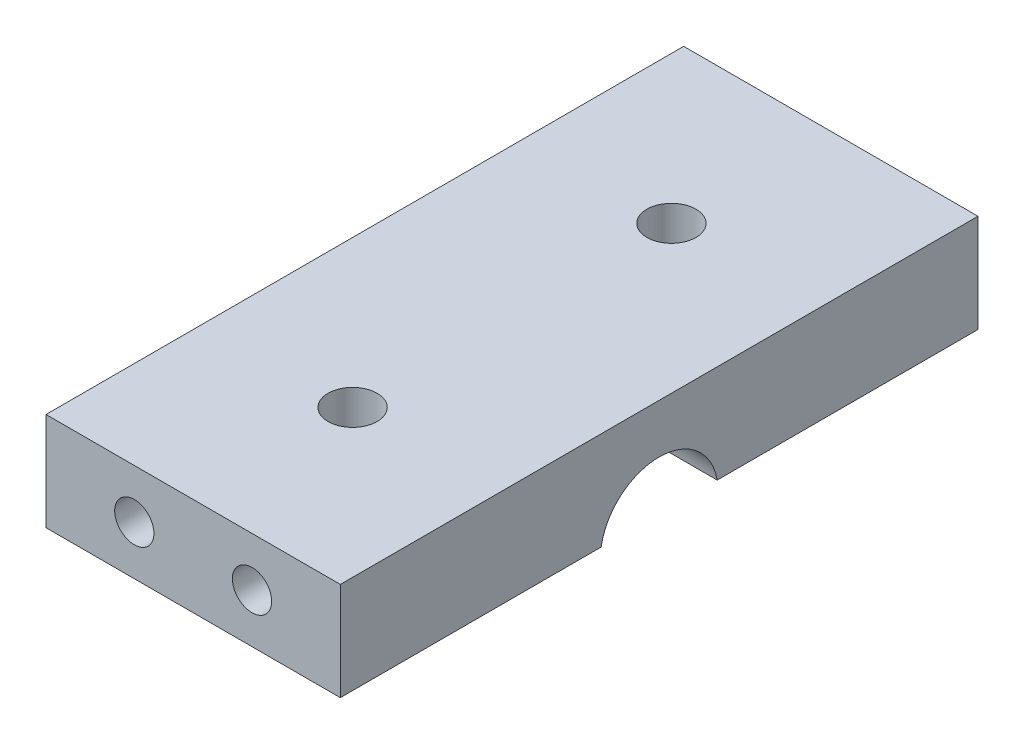
ISO-10303-21;
HEADER;
FILE_DESCRIPTION(('STEP AP214'),'2;1');
FILE_NAME('part.step','',(''),(''),'','','');
FILE_SCHEMA(('AUTOMOTIVE_DESIGN { 1 0 10303 214 1 1 1 1 }'));
ENDSEC;
DATA;
#1=APPLICATION_CONTEXT('core data for automotive mechanical design processes');
#2=APPLICATION_PROTOCOL_DEFINITION('international standard','automotive_design',2000,#1);
#3=PRODUCT_CONTEXT('',#1,'mechanical');
#4=PRODUCT('Part','Part','',(#3));
#5=PRODUCT_RELATED_PRODUCT_CATEGORY('part','',(#4));
#6=PRODUCT_DEFINITION_FORMATION('','',#4);
#7=PRODUCT_DEFINITION_CONTEXT('part definition',#1,'design');
#8=PRODUCT_DEFINITION('design','',#6,#7);
#9=PRODUCT_DEFINITION_SHAPE('','',#8);
#10=(LENGTH_UNIT() NAMED_UNIT(*) SI_UNIT(.MILLI.,.METRE.));
#11=(NAMED_UNIT(*) PLANE_ANGLE_UNIT() SI_UNIT($,.RADIAN.));
#12=(NAMED_UNIT(*) SI_UNIT($,.STERADIAN.) SOLID_ANGLE_UNIT());
#13=UNCERTAINTY_MEASURE_WITH_UNIT(LENGTH_MEASURE(1.E-05),#10,'distance_accuracy_value','');
#14=(GEOMETRIC_REPRESENTATION_CONTEXT(3) GLOBAL_UNCERTAINTY_ASSIGNED_CONTEXT((#13)) GLOBAL_UNIT_ASSIGNED_CONTEXT((#10,
#11,#12)) REPRESENTATION_CONTEXT('',''));
#15=CARTESIAN_POINT('',(0.,0.,0.));
#16=DIRECTION('',(0.,0.,1.));
#17=DIRECTION('',(1.,0.,0.));
#18=AXIS2_PLACEMENT_3D('',#15,#16,#17);
#19=CARTESIAN_POINT('',(0.,0.,-65.));
#20=DIRECTION('',(0.,-1.,0.));
#21=DIRECTION('',(0.,0.,-1.));
#22=AXIS2_PLACEMENT_3D('',#19,#20,#21);
#23=PLANE('',#22);
#24=CARTESIAN_POINT('',(15.,0.,-48.7500000000384));
#25=DIRECTION('',(0.,1.,0.));
#26=DIRECTION('',(0.,0.,1.));
#27=AXIS2_PLACEMENT_3D('',#24,#25,#26);
#28=CIRCLE('',#27,2.49999999999892);
#29=CARTESIAN_POINT('',(15.,0.,-46.2500000000395));
#30=VERTEX_POINT('',#29);
#31=EDGE_CURVE('E106',#30,#30,#28,.T.);
#32=ORIENTED_EDGE('',*,*,#31,.T.);
#33=EDGE_LOOP('',(#32));
#34=FACE_BOUND('',#33,.T.);
#35=DIRECTION('',(1.,0.,0.));
#36=VECTOR('',#35,1.);
#37=CARTESIAN_POINT('',(0.,0.,-38.4160797830984));
#38=LINE('',#37,#36);
#39=CARTESIAN_POINT('',(0.,0.,-38.4160797830984));
#40=VERTEX_POINT('',#39);
#41=CARTESIAN_POINT('',(30.,0.,-38.4160797830984));
#42=VERTEX_POINT('',#41);
#43=EDGE_CURVE('E11',#40,#42,#38,.T.);
#44=ORIENTED_EDGE('',*,*,#43,.F.);
#45=DIRECTION('',(0.,0.,1.));
#46=VECTOR('',#45,1.);
#47=CARTESIAN_POINT('',(0.,0.,0.));
#48=LINE('',#47,#46);
#49=CARTESIAN_POINT('',(0.,0.,-65.));
#50=VERTEX_POINT('',#49);
#51=EDGE_CURVE('E110',#50,#40,#48,.T.);
#52=ORIENTED_EDGE('',*,*,#51,.F.);
#53=DIRECTION('',(-1.,0.,0.));
#54=VECTOR('',#53,1.);
#55=CARTESIAN_POINT('',(0.,0.,-65.));
#56=LINE('',#55,#54);
#57=CARTESIAN_POINT('',(30.,0.,-65.));
#58=VERTEX_POINT('',#57);
#59=EDGE_CURVE('E75',#58,#50,#56,.T.);
#60=ORIENTED_EDGE('',*,*,#59,.F.);
#61=DIRECTION('',(0.,0.,-1.));
#62=VECTOR('',#61,1.);
#63=CARTESIAN_POINT('',(30.,0.,0.));
#64=LINE('',#63,#62);
#65=EDGE_CURVE('E102',#42,#58,#64,.T.);
#66=ORIENTED_EDGE('',*,*,#65,.F.);
#67=EDGE_LOOP('',(#44,#52,#60,#66));
#68=FACE_BOUND('',#67,.T.);
#69=ADVANCED_FACE('F31',(#34,#68),#23,.T.);
#70=CARTESIAN_POINT('',(0.,10.,0.));
#71=DIRECTION('',(1.,0.,0.));
#72=DIRECTION('',(0.,0.,-1.));
#73=AXIS2_PLACEMENT_3D('',#70,#71,#72);
#74=PLANE('',#73);
#75=ORIENTED_EDGE('',*,*,#51,.T.);
#76=CARTESIAN_POINT('',(0.,-1.,-32.5));
#77=DIRECTION('',(1.,0.,0.));
#78=DIRECTION('',(0.,0.,-1.));
#79=AXIS2_PLACEMENT_3D('',#76,#77,#78);
#80=CIRCLE('',#79,5.99999999999876);
#81=CARTESIAN_POINT('',(0.,0.,-26.5839202169016));
#82=VERTEX_POINT('',#81);
#83=EDGE_CURVE('E93',#40,#82,#80,.T.);
#84=ORIENTED_EDGE('',*,*,#83,.T.);
#85=CARTESIAN_POINT('',(0.,0.,0.));
#86=VERTEX_POINT('',#85);
#87=EDGE_CURVE('E127',#82,#86,#48,.T.);
#88=ORIENTED_EDGE('',*,*,#87,.T.);
#89=DIRECTION('',(0.,-1.,0.));
#90=VECTOR('',#89,1.);
#91=CARTESIAN_POINT('',(0.,10.,0.));
#92=LINE('',#91,#90);
#93=CARTESIAN_POINT('',(0.,10.,0.));
#94=VERTEX_POINT('',#93);
#95=EDGE_CURVE('E122',#94,#86,#92,.T.);
#96=ORIENTED_EDGE('',*,*,#95,.F.);
#97=DIRECTION('',(0.,0.,1.));
#98=VECTOR('',#97,1.);
#99=CARTESIAN_POINT('',(0.,10.,0.));
#100=LINE('',#99,#98);
#101=CARTESIAN_POINT('',(0.,10.,-65.));
#102=VERTEX_POINT('',#101);
#103=EDGE_CURVE('E115',#102,#94,#100,.T.);
#104=ORIENTED_EDGE('',*,*,#103,.F.);
#105=DIRECTION('',(0.,-1.,0.));
#106=VECTOR('',#105,1.);
#107=CARTESIAN_POINT('',(0.,10.,-65.));
#108=LINE('',#107,#106);
#109=EDGE_CURVE('E116',#102,#50,#108,.T.);
#110=ORIENTED_EDGE('',*,*,#109,.T.);
#111=EDGE_LOOP('',(#75,#84,#88,#96,#104,#110));
#112=FACE_BOUND('',#111,.T.);
#113=ADVANCED_FACE('F33',(#112),#74,.F.);
#114=CARTESIAN_POINT('',(0.,10.,0.));
#115=DIRECTION('',(0.,0.,-1.));
#116=DIRECTION('',(-1.,0.,0.));
#117=AXIS2_PLACEMENT_3D('',#114,#115,#116);
#118=PLANE('',#117);
#119=CARTESIAN_POINT('',(21.,5.00000075745958,0.));
#120=DIRECTION('',(0.,0.,1.));
#121=DIRECTION('',(1.,0.,0.));
#122=AXIS2_PLACEMENT_3D('',#119,#120,#121);
#123=CIRCLE('',#122,1.999999999873);
#124=CARTESIAN_POINT('',(22.999999999873,5.00000075745958,0.));
#125=VERTEX_POINT('',#124);
#126=EDGE_CURVE('E155',#125,#125,#123,.T.);
#127=ORIENTED_EDGE('',*,*,#126,.F.);
#128=EDGE_LOOP('',(#127));
#129=FACE_BOUND('',#128,.T.);
#130=CARTESIAN_POINT('',(8.99999999999997,5.00000075745958,0.));
#131=DIRECTION('',(0.,0.,1.));
#132=DIRECTION('',(1.,0.,0.));
#133=AXIS2_PLACEMENT_3D('',#130,#131,#132);
#134=CIRCLE('',#133,1.99999999987299);
#135=CARTESIAN_POINT('',(10.999999999873,5.00000075745958,0.));
#136=VERTEX_POINT('',#135);
#137=EDGE_CURVE('E149',#136,#136,#134,.T.);
#138=ORIENTED_EDGE('',*,*,#137,.F.);
#139=EDGE_LOOP('',(#138));
#140=FACE_BOUND('',#139,.T.);
#141=DIRECTION('',(1.,0.,0.));
#142=VECTOR('',#141,1.);
#143=CARTESIAN_POINT('',(0.,0.,0.));
#144=LINE('',#143,#142);
#145=CARTESIAN_POINT('',(30.,0.,0.));
#146=VERTEX_POINT('',#145);
#147=EDGE_CURVE('E108',#86,#146,#144,.T.);
#148=ORIENTED_EDGE('',*,*,#147,.T.);
#149=DIRECTION('',(0.,-1.,0.));
#150=VECTOR('',#149,1.);
#151=CARTESIAN_POINT('',(30.,10.,0.));
#152=LINE('',#151,#150);
#153=CARTESIAN_POINT('',(30.,10.,0.));
#154=VERTEX_POINT('',#153);
#155=EDGE_CURVE('E120',#154,#146,#152,.T.);
#156=ORIENTED_EDGE('',*,*,#155,.F.);
#157=DIRECTION('',(1.,0.,0.));
#158=VECTOR('',#157,1.);
#159=CARTESIAN_POINT('',(0.,10.,0.));
#160=LINE('',#159,#158);
#161=EDGE_CURVE('E83',#94,#154,#160,.T.);
#162=ORIENTED_EDGE('',*,*,#161,.F.);
#163=ORIENTED_EDGE('',*,*,#95,.T.);
#164=EDGE_LOOP('',(#148,#156,#162,#163));
#165=FACE_BOUND('',#164,.T.);
#166=ADVANCED_FACE('F212',(#129,#140,#165),#118,.F.);
#167=CARTESIAN_POINT('',(30.,10.,0.));
#168=DIRECTION('',(-1.,0.,0.));
#169=DIRECTION('',(0.,0.,1.));
#170=AXIS2_PLACEMENT_3D('',#167,#168,#169);
#171=PLANE('',#170);
#172=CARTESIAN_POINT('',(30.,0.,-26.5839202169016));
#173=VERTEX_POINT('',#172);
#174=EDGE_CURVE('E105',#146,#173,#64,.T.);
#175=ORIENTED_EDGE('',*,*,#174,.T.);
#176=CARTESIAN_POINT('',(30.,-1.,-32.5));
#177=DIRECTION('',(1.,0.,0.));
#178=DIRECTION('',(0.,0.,-1.));
#179=AXIS2_PLACEMENT_3D('',#176,#177,#178);
#180=CIRCLE('',#179,5.99999999999876);
#181=EDGE_CURVE('E45',#42,#173,#180,.T.);
#182=ORIENTED_EDGE('',*,*,#181,.F.);
#183=ORIENTED_EDGE('',*,*,#65,.T.);
#184=DIRECTION('',(0.,-1.,0.));
#185=VECTOR('',#184,1.);
#186=CARTESIAN_POINT('',(30.,10.,-65.));
#187=LINE('',#186,#185);
#188=CARTESIAN_POINT('',(30.,10.,-65.));
#189=VERTEX_POINT('',#188);
#190=EDGE_CURVE('E118',#189,#58,#187,.T.);
#191=ORIENTED_EDGE('',*,*,#190,.F.);
#192=DIRECTION('',(0.,0.,-1.));
#193=VECTOR('',#192,1.);
#194=CARTESIAN_POINT('',(30.,10.,0.));
#195=LINE('',#194,#193);
#196=EDGE_CURVE('E133',#154,#189,#195,.T.);
#197=ORIENTED_EDGE('',*,*,#196,.F.);
#198=ORIENTED_EDGE('',*,*,#155,.T.);
#199=EDGE_LOOP('',(#175,#182,#183,#191,#197,#198));
#200=FACE_BOUND('',#199,.T.);
#201=ADVANCED_FACE('F100',(#200),#171,.F.);
#202=CARTESIAN_POINT('',(0.,10.,-65.));
#203=DIRECTION('',(0.,0.,1.));
#204=DIRECTION('',(1.,0.,0.));
#205=AXIS2_PLACEMENT_3D('',#202,#203,#204);
#206=PLANE('',#205);
#207=CARTESIAN_POINT('',(8.99999999944681,5.00000036860126,-65.));
#208=DIRECTION('',(0.,0.,-1.));
#209=DIRECTION('',(-1.,0.,0.));
#210=AXIS2_PLACEMENT_3D('',#207,#208,#209);
#211=CIRCLE('',#210,2.);
#212=CARTESIAN_POINT('',(6.99999999944681,5.00000036860126,-65.));
#213=VERTEX_POINT('',#212);
#214=EDGE_CURVE('E167',#213,#213,#211,.T.);
#215=ORIENTED_EDGE('',*,*,#214,.F.);
#216=EDGE_LOOP('',(#215));
#217=FACE_BOUND('',#216,.T.);
#218=CARTESIAN_POINT('',(20.9999999994468,5.00000036860126,-65.));
#219=DIRECTION('',(0.,0.,-1.));
#220=DIRECTION('',(-1.,0.,0.));
#221=AXIS2_PLACEMENT_3D('',#218,#219,#220);
#222=CIRCLE('',#221,2.);
#223=CARTESIAN_POINT('',(18.9999999994468,5.00000036860126,-65.));
#224=VERTEX_POINT('',#223);
#225=EDGE_CURVE('E161',#224,#224,#222,.T.);
#226=ORIENTED_EDGE('',*,*,#225,.F.);
#227=EDGE_LOOP('',(#226));
#228=FACE_BOUND('',#227,.T.);
#229=ORIENTED_EDGE('',*,*,#59,.T.);
#230=ORIENTED_EDGE('',*,*,#109,.F.);
#231=DIRECTION('',(-1.,0.,0.));
#232=VECTOR('',#231,1.);
#233=CARTESIAN_POINT('',(0.,10.,-65.));
#234=LINE('',#233,#232);
#235=EDGE_CURVE('E54',#189,#102,#234,.T.);
#236=ORIENTED_EDGE('',*,*,#235,.F.);
#237=ORIENTED_EDGE('',*,*,#190,.T.);
#238=EDGE_LOOP('',(#229,#230,#236,#237));
#239=FACE_BOUND('',#238,.T.);
#240=ADVANCED_FACE('F182',(#217,#228,#239),#206,.F.);
#241=CARTESIAN_POINT('',(0.,10.,-65.));
#242=DIRECTION('',(0.,-1.,0.));
#243=DIRECTION('',(0.,0.,-1.));
#244=AXIS2_PLACEMENT_3D('',#241,#242,#243);
#245=PLANE('',#244);
#246=CARTESIAN_POINT('',(15.,10.,-16.2500000000384));
#247=DIRECTION('',(0.,1.,0.));
#248=DIRECTION('',(0.,0.,1.));
#249=AXIS2_PLACEMENT_3D('',#246,#247,#248);
#250=CIRCLE('',#249,2.5);
#251=CARTESIAN_POINT('',(15.,10.,-13.7500000000384));
#252=VERTEX_POINT('',#251);
#253=EDGE_CURVE('E143',#252,#252,#250,.T.);
#254=ORIENTED_EDGE('',*,*,#253,.F.);
#255=EDGE_LOOP('',(#254));
#256=FACE_BOUND('',#255,.T.);
#257=CARTESIAN_POINT('',(15.,10.,-48.7500000000384));
#258=DIRECTION('',(0.,1.,0.));
#259=DIRECTION('',(0.,0.,1.));
#260=AXIS2_PLACEMENT_3D('',#257,#258,#259);
#261=CIRCLE('',#260,2.49999999999892);
#262=CARTESIAN_POINT('',(15.,10.,-46.2500000000395));
#263=VERTEX_POINT('',#262);
#264=EDGE_CURVE('E137',#263,#263,#261,.T.);
#265=ORIENTED_EDGE('',*,*,#264,.F.);
#266=EDGE_LOOP('',(#265));
#267=FACE_BOUND('',#266,.T.);
#268=ORIENTED_EDGE('',*,*,#103,.T.);
#269=ORIENTED_EDGE('',*,*,#161,.T.);
#270=ORIENTED_EDGE('',*,*,#196,.T.);
#271=ORIENTED_EDGE('',*,*,#235,.T.);
#272=EDGE_LOOP('',(#268,#269,#270,#271));
#273=FACE_BOUND('',#272,.T.);
#274=ADVANCED_FACE('F185',(#256,#267,#273),#245,.F.);
#275=CARTESIAN_POINT('',(15.,0.,-16.2500000000384));
#276=DIRECTION('',(0.,1.,0.));
#277=DIRECTION('',(0.,0.,1.));
#278=AXIS2_PLACEMENT_3D('',#275,#276,#277);
#279=CIRCLE('',#278,2.5);
#280=CARTESIAN_POINT('',(15.,0.,-13.7500000000384));
#281=VERTEX_POINT('',#280);
#282=EDGE_CURVE('E140',#281,#281,#279,.T.);
#283=ORIENTED_EDGE('',*,*,#282,.T.);
#284=EDGE_LOOP('',(#283));
#285=FACE_BOUND('',#284,.T.);
#286=DIRECTION('',(1.,0.,0.));
#287=VECTOR('',#286,1.);
#288=CARTESIAN_POINT('',(0.,0.,-26.5839202169016));
#289=LINE('',#288,#287);
#290=EDGE_CURVE('E39',#173,#82,#289,.F.);
#291=ORIENTED_EDGE('',*,*,#290,.F.);
#292=ORIENTED_EDGE('',*,*,#174,.F.);
#293=ORIENTED_EDGE('',*,*,#147,.F.);
#294=ORIENTED_EDGE('',*,*,#87,.F.);
#295=EDGE_LOOP('',(#291,#292,#293,#294));
#296=FACE_BOUND('',#295,.T.);
#297=ADVANCED_FACE('F130',(#285,#296),#23,.T.);
#298=CARTESIAN_POINT('',(0.,-1.,-32.5));
#299=DIRECTION('',(1.,0.,0.));
#300=DIRECTION('',(0.,0.,-1.));
#301=AXIS2_PLACEMENT_3D('',#298,#299,#300);
#302=CYLINDRICAL_SURFACE('',#301,5.99999999999876);
#303=ORIENTED_EDGE('',*,*,#43,.T.);
#304=ORIENTED_EDGE('',*,*,#181,.T.);
#305=ORIENTED_EDGE('',*,*,#290,.T.);
#306=ORIENTED_EDGE('',*,*,#83,.F.);
#307=EDGE_LOOP('',(#303,#304,#305,#306));
#308=FACE_BOUND('',#307,.T.);
#309=ADVANCED_FACE('F91',(#308),#302,.F.);
#310=CARTESIAN_POINT('',(15.,0.,-48.7500000000384));
#311=DIRECTION('',(0.,1.,0.));
#312=DIRECTION('',(0.,0.,1.));
#313=AXIS2_PLACEMENT_3D('',#310,#311,#312);
#314=CYLINDRICAL_SURFACE('',#313,2.49999999999892);
#315=ORIENTED_EDGE('',*,*,#31,.F.);
#316=EDGE_LOOP('',(#315));
#317=FACE_BOUND('',#316,.T.);
#318=ORIENTED_EDGE('',*,*,#264,.T.);
#319=EDGE_LOOP('',(#318));
#320=FACE_BOUND('',#319,.T.);
#321=ADVANCED_FACE('F220',(#317,#320),#314,.F.);
#322=CARTESIAN_POINT('',(15.,0.,-16.2500000000384));
#323=DIRECTION('',(0.,1.,0.));
#324=DIRECTION('',(0.,0.,1.));
#325=AXIS2_PLACEMENT_3D('',#322,#323,#324);
#326=CYLINDRICAL_SURFACE('',#325,2.5);
#327=ORIENTED_EDGE('',*,*,#282,.F.);
#328=EDGE_LOOP('',(#327));
#329=FACE_BOUND('',#328,.T.);
#330=ORIENTED_EDGE('',*,*,#253,.T.);
#331=EDGE_LOOP('',(#330));
#332=FACE_BOUND('',#331,.T.);
#333=ADVANCED_FACE('F225',(#329,#332),#326,.F.);
#334=CARTESIAN_POINT('',(8.99999999999997,5.00000075745958,-20.));
#335=DIRECTION('',(0.,0.,1.));
#336=DIRECTION('',(1.,0.,0.));
#337=AXIS2_PLACEMENT_3D('',#334,#335,#336);
#338=CYLINDRICAL_SURFACE('',#337,1.99999999987299);
#339=CARTESIAN_POINT('',(8.99999999999997,5.00000075745958,-20.));
#340=DIRECTION('',(0.,0.,1.));
#341=DIRECTION('',(1.,0.,0.));
#342=AXIS2_PLACEMENT_3D('',#339,#340,#341);
#343=CIRCLE('',#342,1.99999999987299);
#344=CARTESIAN_POINT('',(10.999999999873,5.00000075745958,-20.));
#345=VERTEX_POINT('',#344);
#346=EDGE_CURVE('E146',#345,#345,#343,.T.);
#347=ORIENTED_EDGE('',*,*,#346,.F.);
#348=EDGE_LOOP('',(#347));
#349=FACE_BOUND('',#348,.T.);
#350=ORIENTED_EDGE('',*,*,#137,.T.);
#351=EDGE_LOOP('',(#350));
#352=FACE_BOUND('',#351,.T.);
#353=ADVANCED_FACE('F228',(#349,#352),#338,.F.);
#354=CARTESIAN_POINT('',(8.99999999999997,5.00000075745958,-20.));
#355=DIRECTION('',(0.,0.,1.));
#356=DIRECTION('',(1.,0.,0.));
#357=AXIS2_PLACEMENT_3D('',#354,#355,#356);
#358=PLANE('',#357);
#359=ORIENTED_EDGE('',*,*,#346,.T.);
#360=EDGE_LOOP('',(#359));
#361=FACE_BOUND('',#360,.T.);
#362=ADVANCED_FACE('F248',(#361),#358,.T.);
#363=CARTESIAN_POINT('',(21.,5.00000075745958,-20.));
#364=DIRECTION('',(0.,0.,1.));
#365=DIRECTION('',(1.,0.,0.));
#366=AXIS2_PLACEMENT_3D('',#363,#364,#365);
#367=CYLINDRICAL_SURFACE('',#366,1.999999999873);
#368=CARTESIAN_POINT('',(21.,5.00000075745958,-20.));
#369=DIRECTION('',(0.,0.,1.));
#370=DIRECTION('',(1.,0.,0.));
#371=AXIS2_PLACEMENT_3D('',#368,#369,#370);
#372=CIRCLE('',#371,1.999999999873);
#373=CARTESIAN_POINT('',(22.999999999873,5.00000075745958,-20.));
#374=VERTEX_POINT('',#373);
#375=EDGE_CURVE('E152',#374,#374,#372,.T.);
#376=ORIENTED_EDGE('',*,*,#375,.F.);
#377=EDGE_LOOP('',(#376));
#378=FACE_BOUND('',#377,.T.);
#379=ORIENTED_EDGE('',*,*,#126,.T.);
#380=EDGE_LOOP('',(#379));
#381=FACE_BOUND('',#380,.T.);
#382=ADVANCED_FACE('F200',(#378,#381),#367,.F.);
#383=CARTESIAN_POINT('',(21.,5.00000075745958,-20.));
#384=DIRECTION('',(0.,0.,1.));
#385=DIRECTION('',(1.,0.,0.));
#386=AXIS2_PLACEMENT_3D('',#383,#384,#385);
#387=PLANE('',#386);
#388=ORIENTED_EDGE('',*,*,#375,.T.);
#389=EDGE_LOOP('',(#388));
#390=FACE_BOUND('',#389,.T.);
#391=ADVANCED_FACE('F191',(#390),#387,.T.);
#392=CARTESIAN_POINT('',(20.9999999994468,5.00000036860126,-45.));
#393=DIRECTION('',(0.,0.,-1.));
#394=DIRECTION('',(-1.,0.,0.));
#395=AXIS2_PLACEMENT_3D('',#392,#393,#394);
#396=CYLINDRICAL_SURFACE('',#395,2.);
#397=CARTESIAN_POINT('',(20.9999999994468,5.00000036860126,-45.));
#398=DIRECTION('',(0.,0.,-1.));
#399=DIRECTION('',(-1.,0.,0.));
#400=AXIS2_PLACEMENT_3D('',#397,#398,#399);
#401=CIRCLE('',#400,2.);
#402=CARTESIAN_POINT('',(18.9999999994468,5.00000036860126,-45.));
#403=VERTEX_POINT('',#402);
#404=EDGE_CURVE('E158',#403,#403,#401,.T.);
#405=ORIENTED_EDGE('',*,*,#404,.F.);
#406=EDGE_LOOP('',(#405));
#407=FACE_BOUND('',#406,.T.);
#408=ORIENTED_EDGE('',*,*,#225,.T.);
#409=EDGE_LOOP('',(#408));
#410=FACE_BOUND('',#409,.T.);
#411=ADVANCED_FACE('F189',(#407,#410),#396,.F.);
#412=CARTESIAN_POINT('',(20.9999999994468,5.00000036860126,-45.));
#413=DIRECTION('',(0.,0.,-1.));
#414=DIRECTION('',(-1.,0.,0.));
#415=AXIS2_PLACEMENT_3D('',#412,#413,#414);
#416=PLANE('',#415);
#417=ORIENTED_EDGE('',*,*,#404,.T.);
#418=EDGE_LOOP('',(#417));
#419=FACE_BOUND('',#418,.T.);
#420=ADVANCED_FACE('F178',(#419),#416,.T.);
#421=CARTESIAN_POINT('',(8.99999999944681,5.00000036860126,-45.));
#422=DIRECTION('',(0.,0.,-1.));
#423=DIRECTION('',(-1.,0.,0.));
#424=AXIS2_PLACEMENT_3D('',#421,#422,#423);
#425=CYLINDRICAL_SURFACE('',#424,2.);
#426=CARTESIAN_POINT('',(8.99999999944681,5.00000036860126,-45.));
#427=DIRECTION('',(0.,0.,-1.));
#428=DIRECTION('',(-1.,0.,0.));
#429=AXIS2_PLACEMENT_3D('',#426,#427,#428);
#430=CIRCLE('',#429,2.);
#431=CARTESIAN_POINT('',(6.99999999944681,5.00000036860126,-45.));
#432=VERTEX_POINT('',#431);
#433=EDGE_CURVE('E164',#432,#432,#430,.T.);
#434=ORIENTED_EDGE('',*,*,#433,.F.);
#435=EDGE_LOOP('',(#434));
#436=FACE_BOUND('',#435,.T.);
#437=ORIENTED_EDGE('',*,*,#214,.T.);
#438=EDGE_LOOP('',(#437));
#439=FACE_BOUND('',#438,.T.);
#440=ADVANCED_FACE('F175',(#436,#439),#425,.F.);
#441=CARTESIAN_POINT('',(8.99999999944681,5.00000036860126,-45.));
#442=DIRECTION('',(0.,0.,-1.));
#443=DIRECTION('',(-1.,0.,0.));
#444=AXIS2_PLACEMENT_3D('',#441,#442,#443);
#445=PLANE('',#444);
#446=ORIENTED_EDGE('',*,*,#433,.T.);
#447=EDGE_LOOP('',(#446));
#448=FACE_BOUND('',#447,.T.);
#449=ADVANCED_FACE('F173',(#448),#445,.T.);
#450=CLOSED_SHELL('',(#69,#113,#166,#201,#240,#274,#297,#309,#321,#333,#353,#362,#382,#391,#411,
#420,#440,#449));
#451=MANIFOLD_SOLID_BREP('B2',#450);
#452=ADVANCED_BREP_SHAPE_REPRESENTATION('',(#18,#451),#14);
#453=SHAPE_DEFINITION_REPRESENTATION(#9,#452);
ENDSEC;
END-ISO-10303-21;
